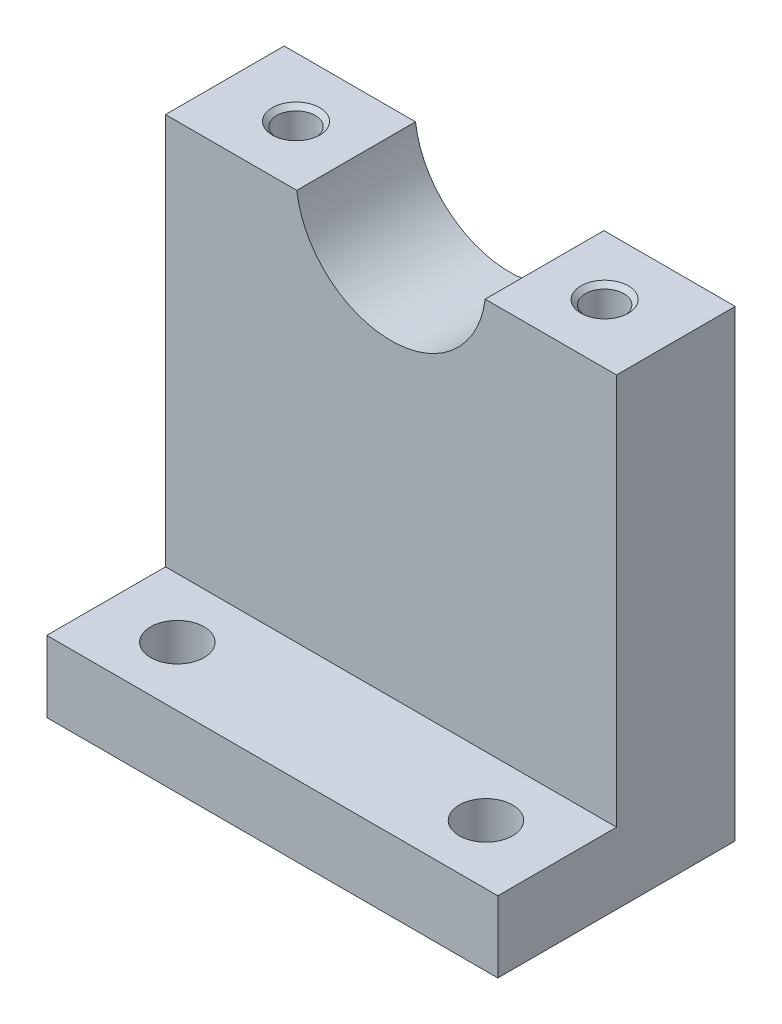
ISO-10303-21;
HEADER;
FILE_DESCRIPTION(('STEP AP214'),'2;1');
FILE_NAME('part.step','',(''),(''),'','','');
FILE_SCHEMA(('AUTOMOTIVE_DESIGN { 1 0 10303 214 1 1 1 1 }'));
ENDSEC;
DATA;
#1=APPLICATION_CONTEXT('core data for automotive mechanical design processes');
#2=APPLICATION_PROTOCOL_DEFINITION('international standard','automotive_design',2000,#1);
#3=PRODUCT_CONTEXT('',#1,'mechanical');
#4=PRODUCT('Part','Part','',(#3));
#5=PRODUCT_RELATED_PRODUCT_CATEGORY('part','',(#4));
#6=PRODUCT_DEFINITION_FORMATION('','',#4);
#7=PRODUCT_DEFINITION_CONTEXT('part definition',#1,'design');
#8=PRODUCT_DEFINITION('design','',#6,#7);
#9=PRODUCT_DEFINITION_SHAPE('','',#8);
#10=(LENGTH_UNIT() NAMED_UNIT(*) SI_UNIT(.MILLI.,.METRE.));
#11=(NAMED_UNIT(*) PLANE_ANGLE_UNIT() SI_UNIT($,.RADIAN.));
#12=(NAMED_UNIT(*) SI_UNIT($,.STERADIAN.) SOLID_ANGLE_UNIT());
#13=UNCERTAINTY_MEASURE_WITH_UNIT(LENGTH_MEASURE(1.E-05),#10,'distance_accuracy_value','');
#14=(GEOMETRIC_REPRESENTATION_CONTEXT(3) GLOBAL_UNCERTAINTY_ASSIGNED_CONTEXT((#13)) GLOBAL_UNIT_ASSIGNED_CONTEXT((#10,
#11,#12)) REPRESENTATION_CONTEXT('',''));
#15=CARTESIAN_POINT('',(0.,0.,0.));
#16=DIRECTION('',(0.,0.,1.));
#17=DIRECTION('',(1.,0.,0.));
#18=AXIS2_PLACEMENT_3D('',#15,#16,#17);
#19=CARTESIAN_POINT('',(13.,23.93588478634,5.));
#20=DIRECTION('',(0.,1.,0.));
#21=DIRECTION('',(-1.,0.,0.));
#22=AXIS2_PLACEMENT_3D('',#19,#20,#21);
#23=CONICAL_SURFACE('',#22,1.62100000005239,1.04719755120201);
#24=CARTESIAN_POINT('',(13.,22.9999999999393,5.0000000000523));
#25=VERTEX_POINT('',#24);
#26=VERTEX_LOOP('',#25);
#27=FACE_BOUND('',#26,.T.);
#28=CARTESIAN_POINT('',(13.,23.9358847863564,5.));
#29=DIRECTION('',(0.,1.,0.));
#30=DIRECTION('',(0.,0.,1.));
#31=AXIS2_PLACEMENT_3D('',#28,#29,#30);
#32=CIRCLE('',#31,1.621);
#33=CARTESIAN_POINT('',(13.,23.9358847863564,6.621));
#34=VERTEX_POINT('',#33);
#35=EDGE_CURVE('E230',#34,#34,#32,.T.);
#36=ORIENTED_EDGE('',*,*,#35,.T.);
#37=EDGE_LOOP('',(#36));
#38=FACE_BOUND('',#37,.T.);
#39=ADVANCED_FACE('F17',(#27,#38),#23,.F.);
#40=CARTESIAN_POINT('',(-13.,23.93588478634,5.));
#41=DIRECTION('',(0.,1.,0.));
#42=DIRECTION('',(-1.,0.,0.));
#43=AXIS2_PLACEMENT_3D('',#40,#41,#42);
#44=CONICAL_SURFACE('',#43,1.62100000005239,1.04719755120201);
#45=CARTESIAN_POINT('',(-13.,22.9999999999393,5.0000000000523));
#46=VERTEX_POINT('',#45);
#47=VERTEX_LOOP('',#46);
#48=FACE_BOUND('',#47,.T.);
#49=CARTESIAN_POINT('',(-13.,23.9358847863564,5.));
#50=DIRECTION('',(0.,1.,0.));
#51=DIRECTION('',(0.,0.,1.));
#52=AXIS2_PLACEMENT_3D('',#49,#50,#51);
#53=CIRCLE('',#52,1.621);
#54=CARTESIAN_POINT('',(-13.,23.9358847863564,6.621));
#55=VERTEX_POINT('',#54);
#56=EDGE_CURVE('E226',#55,#55,#53,.T.);
#57=ORIENTED_EDGE('',*,*,#56,.T.);
#58=EDGE_LOOP('',(#57));
#59=FACE_BOUND('',#58,.T.);
#60=ADVANCED_FACE('F335',(#48,#59),#44,.F.);
#61=CARTESIAN_POINT('',(13.,23.,5.));
#62=DIRECTION('',(0.,1.,0.));
#63=DIRECTION('',(0.,0.,1.));
#64=AXIS2_PLACEMENT_3D('',#61,#62,#63);
#65=CYLINDRICAL_SURFACE('',#64,1.621);
#66=ORIENTED_EDGE('',*,*,#35,.F.);
#67=EDGE_LOOP('',(#66));
#68=FACE_BOUND('',#67,.T.);
#69=CARTESIAN_POINT('',(13.,38.6210000000347,5.));
#70=DIRECTION('',(0.,1.,0.));
#71=DIRECTION('',(0.,0.,1.));
#72=AXIS2_PLACEMENT_3D('',#69,#70,#71);
#73=CIRCLE('',#72,1.62099999999555);
#74=CARTESIAN_POINT('',(13.,38.6210000000347,6.62099999999555));
#75=VERTEX_POINT('',#74);
#76=EDGE_CURVE('E222',#75,#75,#73,.T.);
#77=ORIENTED_EDGE('',*,*,#76,.T.);
#78=EDGE_LOOP('',(#77));
#79=FACE_BOUND('',#78,.T.);
#80=ADVANCED_FACE('F332',(#68,#79),#65,.F.);
#81=CARTESIAN_POINT('',(-13.,23.,5.));
#82=DIRECTION('',(0.,1.,0.));
#83=DIRECTION('',(0.,0.,1.));
#84=AXIS2_PLACEMENT_3D('',#81,#82,#83);
#85=CYLINDRICAL_SURFACE('',#84,1.621);
#86=ORIENTED_EDGE('',*,*,#56,.F.);
#87=EDGE_LOOP('',(#86));
#88=FACE_BOUND('',#87,.T.);
#89=CARTESIAN_POINT('',(-13.,38.6210000000347,5.));
#90=DIRECTION('',(0.,1.,0.));
#91=DIRECTION('',(0.,0.,1.));
#92=AXIS2_PLACEMENT_3D('',#89,#90,#91);
#93=CIRCLE('',#92,1.62099999999555);
#94=CARTESIAN_POINT('',(-13.,38.6210000000347,6.62099999999555));
#95=VERTEX_POINT('',#94);
#96=EDGE_CURVE('E211',#95,#95,#93,.T.);
#97=ORIENTED_EDGE('',*,*,#96,.T.);
#98=EDGE_LOOP('',(#97));
#99=FACE_BOUND('',#98,.T.);
#100=ADVANCED_FACE('F261',(#88,#99),#85,.F.);
#101=CARTESIAN_POINT('',(13.,6.,15.));
#102=DIRECTION('',(0.,1.,0.));
#103=DIRECTION('',(0.,0.,1.));
#104=AXIS2_PLACEMENT_3D('',#101,#102,#103);
#105=CYLINDRICAL_SURFACE('',#104,2.25);
#106=CARTESIAN_POINT('',(13.,6.,15.));
#107=DIRECTION('',(0.,1.,0.));
#108=DIRECTION('',(0.,0.,1.));
#109=AXIS2_PLACEMENT_3D('',#106,#107,#108);
#110=CIRCLE('',#109,2.25);
#111=CARTESIAN_POINT('',(13.,6.,17.25));
#112=VERTEX_POINT('',#111);
#113=EDGE_CURVE('E20',#112,#112,#110,.F.);
#114=ORIENTED_EDGE('',*,*,#113,.F.);
#115=EDGE_LOOP('',(#114));
#116=FACE_BOUND('',#115,.T.);
#117=CARTESIAN_POINT('',(13.,0.,15.));
#118=DIRECTION('',(0.,1.,0.));
#119=DIRECTION('',(0.,0.,1.));
#120=AXIS2_PLACEMENT_3D('',#117,#118,#119);
#121=CIRCLE('',#120,2.25);
#122=CARTESIAN_POINT('',(13.,0.,17.25));
#123=VERTEX_POINT('',#122);
#124=EDGE_CURVE('E176',#123,#123,#121,.F.);
#125=ORIENTED_EDGE('',*,*,#124,.T.);
#126=EDGE_LOOP('',(#125));
#127=FACE_BOUND('',#126,.T.);
#128=ADVANCED_FACE('F257',(#116,#127),#105,.F.);
#129=CARTESIAN_POINT('',(-13.,6.,15.));
#130=DIRECTION('',(0.,1.,0.));
#131=DIRECTION('',(0.,0.,1.));
#132=AXIS2_PLACEMENT_3D('',#129,#130,#131);
#133=CYLINDRICAL_SURFACE('',#132,2.25);
#134=CARTESIAN_POINT('',(-13.,6.,15.));
#135=DIRECTION('',(0.,1.,0.));
#136=DIRECTION('',(0.,0.,1.));
#137=AXIS2_PLACEMENT_3D('',#134,#135,#136);
#138=CIRCLE('',#137,2.25);
#139=CARTESIAN_POINT('',(-13.,6.,17.25));
#140=VERTEX_POINT('',#139);
#141=EDGE_CURVE('E177',#140,#140,#138,.F.);
#142=ORIENTED_EDGE('',*,*,#141,.F.);
#143=EDGE_LOOP('',(#142));
#144=FACE_BOUND('',#143,.T.);
#145=CARTESIAN_POINT('',(-13.,0.,15.));
#146=DIRECTION('',(0.,1.,0.));
#147=DIRECTION('',(0.,0.,1.));
#148=AXIS2_PLACEMENT_3D('',#145,#146,#147);
#149=CIRCLE('',#148,2.25);
#150=CARTESIAN_POINT('',(-13.,0.,17.25));
#151=VERTEX_POINT('',#150);
#152=EDGE_CURVE('E202',#151,#151,#149,.F.);
#153=ORIENTED_EDGE('',*,*,#152,.T.);
#154=EDGE_LOOP('',(#153));
#155=FACE_BOUND('',#154,.T.);
#156=ADVANCED_FACE('F260',(#144,#155),#133,.F.);
#157=CARTESIAN_POINT('',(13.,39.000000000101,5.));
#158=DIRECTION('',(0.,1.,0.));
#159=DIRECTION('',(0.,0.,1.));
#160=AXIS2_PLACEMENT_3D('',#157,#158,#159);
#161=CONICAL_SURFACE('',#160,2.00000000006185,0.785398163397448);
#162=ORIENTED_EDGE('',*,*,#76,.F.);
#163=EDGE_LOOP('',(#162));
#164=FACE_BOUND('',#163,.T.);
#165=CARTESIAN_POINT('',(13.,39.0000000000441,5.));
#166=DIRECTION('',(0.,1.,0.));
#167=DIRECTION('',(0.,0.,1.));
#168=AXIS2_PLACEMENT_3D('',#165,#166,#167);
#169=CIRCLE('',#168,2.000000000005);
#170=CARTESIAN_POINT('',(13.,39.0000000000441,7.000000000005));
#171=VERTEX_POINT('',#170);
#172=EDGE_CURVE('E131',#171,#171,#169,.T.);
#173=ORIENTED_EDGE('',*,*,#172,.T.);
#174=EDGE_LOOP('',(#173));
#175=FACE_BOUND('',#174,.T.);
#176=ADVANCED_FACE('F315',(#164,#175),#161,.F.);
#177=CARTESIAN_POINT('',(-13.,39.000000000101,5.));
#178=DIRECTION('',(0.,1.,0.));
#179=DIRECTION('',(0.,0.,1.));
#180=AXIS2_PLACEMENT_3D('',#177,#178,#179);
#181=CONICAL_SURFACE('',#180,2.00000000006185,0.785398163397448);
#182=ORIENTED_EDGE('',*,*,#96,.F.);
#183=EDGE_LOOP('',(#182));
#184=FACE_BOUND('',#183,.T.);
#185=CARTESIAN_POINT('',(-13.,39.0000000000441,5.));
#186=DIRECTION('',(0.,1.,0.));
#187=DIRECTION('',(0.,0.,1.));
#188=AXIS2_PLACEMENT_3D('',#185,#186,#187);
#189=CIRCLE('',#188,2.000000000005);
#190=CARTESIAN_POINT('',(-13.,39.0000000000441,7.000000000005));
#191=VERTEX_POINT('',#190);
#192=EDGE_CURVE('E106',#191,#191,#189,.T.);
#193=ORIENTED_EDGE('',*,*,#192,.T.);
#194=EDGE_LOOP('',(#193));
#195=FACE_BOUND('',#194,.T.);
#196=ADVANCED_FACE('F313',(#184,#195),#181,.F.);
#197=CARTESIAN_POINT('',(0.,40.,20.));
#198=DIRECTION('',(0.,0.,1.));
#199=DIRECTION('',(1.,0.,0.));
#200=AXIS2_PLACEMENT_3D('',#197,#198,#199);
#201=PLANE('',#200);
#202=DIRECTION('',(0.,1.,0.));
#203=VECTOR('',#202,1.);
#204=CARTESIAN_POINT('',(-19.,39.,20.));
#205=LINE('',#204,#203);
#206=CARTESIAN_POINT('',(-19.,6.,20.));
#207=VERTEX_POINT('',#206);
#208=CARTESIAN_POINT('',(-19.,0.,20.));
#209=VERTEX_POINT('',#208);
#210=EDGE_CURVE('E164',#207,#209,#205,.F.);
#211=ORIENTED_EDGE('',*,*,#210,.T.);
#212=DIRECTION('',(1.,0.,0.));
#213=VECTOR('',#212,1.);
#214=CARTESIAN_POINT('',(-19.,0.,20.));
#215=LINE('',#214,#213);
#216=CARTESIAN_POINT('',(19.,0.,20.));
#217=VERTEX_POINT('',#216);
#218=EDGE_CURVE('E173',#209,#217,#215,.T.);
#219=ORIENTED_EDGE('',*,*,#218,.T.);
#220=DIRECTION('',(0.,1.,0.));
#221=VECTOR('',#220,1.);
#222=CARTESIAN_POINT('',(19.,0.,20.));
#223=LINE('',#222,#221);
#224=CARTESIAN_POINT('',(19.,6.,20.));
#225=VERTEX_POINT('',#224);
#226=EDGE_CURVE('E151',#217,#225,#223,.T.);
#227=ORIENTED_EDGE('',*,*,#226,.T.);
#228=DIRECTION('',(1.,0.,0.));
#229=VECTOR('',#228,1.);
#230=CARTESIAN_POINT('',(19.,6.,20.));
#231=LINE('',#230,#229);
#232=EDGE_CURVE('E185',#207,#225,#231,.T.);
#233=ORIENTED_EDGE('',*,*,#232,.F.);
#234=EDGE_LOOP('',(#211,#219,#227,#233));
#235=FACE_BOUND('',#234,.T.);
#236=ADVANCED_FACE('F290',(#235),#201,.T.);
#237=CARTESIAN_POINT('',(19.,6.,10.));
#238=DIRECTION('',(0.,0.,1.));
#239=DIRECTION('',(1.,0.,0.));
#240=AXIS2_PLACEMENT_3D('',#237,#238,#239);
#241=PLANE('',#240);
#242=DIRECTION('',(1.,0.,0.));
#243=VECTOR('',#242,1.);
#244=CARTESIAN_POINT('',(19.,6.,10.));
#245=LINE('',#244,#243);
#246=CARTESIAN_POINT('',(19.,6.,10.));
#247=VERTEX_POINT('',#246);
#248=CARTESIAN_POINT('',(-19.,6.,10.));
#249=VERTEX_POINT('',#248);
#250=EDGE_CURVE('E188',#247,#249,#245,.F.);
#251=ORIENTED_EDGE('',*,*,#250,.F.);
#252=DIRECTION('',(0.,1.,0.));
#253=VECTOR('',#252,1.);
#254=CARTESIAN_POINT('',(19.,0.,10.));
#255=LINE('',#254,#253);
#256=CARTESIAN_POINT('',(19.,39.,10.));
#257=VERTEX_POINT('',#256);
#258=EDGE_CURVE('E152',#247,#257,#255,.T.);
#259=ORIENTED_EDGE('',*,*,#258,.T.);
#260=DIRECTION('',(1.,0.,0.));
#261=VECTOR('',#260,1.);
#262=CARTESIAN_POINT('',(19.,39.,10.));
#263=LINE('',#262,#261);
#264=CARTESIAN_POINT('',(7.93725393319377,39.,10.));
#265=VERTEX_POINT('',#264);
#266=EDGE_CURVE('E86',#257,#265,#263,.F.);
#267=ORIENTED_EDGE('',*,*,#266,.T.);
#268=CARTESIAN_POINT('',(0.,40.,10.));
#269=DIRECTION('',(0.,0.,1.));
#270=DIRECTION('',(1.,0.,0.));
#271=AXIS2_PLACEMENT_3D('',#268,#269,#270);
#272=CIRCLE('',#271,8.);
#273=CARTESIAN_POINT('',(-7.93725393319377,39.,10.));
#274=VERTEX_POINT('',#273);
#275=EDGE_CURVE('E88',#265,#274,#272,.F.);
#276=ORIENTED_EDGE('',*,*,#275,.T.);
#277=DIRECTION('',(1.,0.,0.));
#278=VECTOR('',#277,1.);
#279=CARTESIAN_POINT('',(-7.93725393319377,39.,10.));
#280=LINE('',#279,#278);
#281=CARTESIAN_POINT('',(-19.,39.,10.));
#282=VERTEX_POINT('',#281);
#283=EDGE_CURVE('E93',#274,#282,#280,.F.);
#284=ORIENTED_EDGE('',*,*,#283,.T.);
#285=DIRECTION('',(0.,1.,0.));
#286=VECTOR('',#285,1.);
#287=CARTESIAN_POINT('',(-19.,39.,10.));
#288=LINE('',#287,#286);
#289=EDGE_CURVE('E125',#282,#249,#288,.F.);
#290=ORIENTED_EDGE('',*,*,#289,.T.);
#291=EDGE_LOOP('',(#251,#259,#267,#276,#284,#290));
#292=FACE_BOUND('',#291,.T.);
#293=ADVANCED_FACE('F91',(#292),#241,.T.);
#294=CARTESIAN_POINT('',(19.,6.,30.));
#295=DIRECTION('',(0.,1.,0.));
#296=DIRECTION('',(0.,0.,1.));
#297=AXIS2_PLACEMENT_3D('',#294,#295,#296);
#298=PLANE('',#297);
#299=ORIENTED_EDGE('',*,*,#141,.T.);
#300=EDGE_LOOP('',(#299));
#301=FACE_BOUND('',#300,.T.);
#302=ORIENTED_EDGE('',*,*,#113,.T.);
#303=EDGE_LOOP('',(#302));
#304=FACE_BOUND('',#303,.T.);
#305=DIRECTION('',(0.,0.,-1.));
#306=VECTOR('',#305,1.);
#307=CARTESIAN_POINT('',(-19.,6.,20.));
#308=LINE('',#307,#306);
#309=EDGE_CURVE('E158',#249,#207,#308,.F.);
#310=ORIENTED_EDGE('',*,*,#309,.T.);
#311=ORIENTED_EDGE('',*,*,#232,.T.);
#312=DIRECTION('',(0.,0.,1.));
#313=VECTOR('',#312,1.);
#314=CARTESIAN_POINT('',(19.,6.,20.));
#315=LINE('',#314,#313);
#316=EDGE_CURVE('E136',#225,#247,#315,.F.);
#317=ORIENTED_EDGE('',*,*,#316,.T.);
#318=ORIENTED_EDGE('',*,*,#250,.T.);
#319=EDGE_LOOP('',(#310,#311,#317,#318));
#320=FACE_BOUND('',#319,.T.);
#321=ADVANCED_FACE('F254',(#301,#304,#320),#298,.T.);
#322=CARTESIAN_POINT('',(-19.,0.,20.));
#323=DIRECTION('',(0.,1.,0.));
#324=DIRECTION('',(0.,0.,1.));
#325=AXIS2_PLACEMENT_3D('',#322,#323,#324);
#326=PLANE('',#325);
#327=ORIENTED_EDGE('',*,*,#152,.F.);
#328=EDGE_LOOP('',(#327));
#329=FACE_BOUND('',#328,.T.);
#330=ORIENTED_EDGE('',*,*,#124,.F.);
#331=EDGE_LOOP('',(#330));
#332=FACE_BOUND('',#331,.T.);
#333=DIRECTION('',(0.,0.,1.));
#334=VECTOR('',#333,1.);
#335=CARTESIAN_POINT('',(19.,0.,20.));
#336=LINE('',#335,#334);
#337=CARTESIAN_POINT('',(19.,0.,0.));
#338=VERTEX_POINT('',#337);
#339=EDGE_CURVE('E147',#338,#217,#336,.T.);
#340=ORIENTED_EDGE('',*,*,#339,.T.);
#341=ORIENTED_EDGE('',*,*,#218,.F.);
#342=DIRECTION('',(0.,0.,-1.));
#343=VECTOR('',#342,1.);
#344=CARTESIAN_POINT('',(-19.,0.,20.));
#345=LINE('',#344,#343);
#346=CARTESIAN_POINT('',(-19.,0.,0.));
#347=VERTEX_POINT('',#346);
#348=EDGE_CURVE('E126',#209,#347,#345,.T.);
#349=ORIENTED_EDGE('',*,*,#348,.T.);
#350=DIRECTION('',(1.,0.,0.));
#351=VECTOR('',#350,1.);
#352=CARTESIAN_POINT('',(0.,0.,0.));
#353=LINE('',#352,#351);
#354=EDGE_CURVE('E144',#347,#338,#353,.T.);
#355=ORIENTED_EDGE('',*,*,#354,.T.);
#356=EDGE_LOOP('',(#340,#341,#349,#355));
#357=FACE_BOUND('',#356,.T.);
#358=ADVANCED_FACE('F265',(#329,#332,#357),#326,.F.);
#359=CARTESIAN_POINT('',(19.,0.,20.));
#360=DIRECTION('',(-1.,0.,0.));
#361=DIRECTION('',(0.,0.,1.));
#362=AXIS2_PLACEMENT_3D('',#359,#360,#361);
#363=PLANE('',#362);
#364=ORIENTED_EDGE('',*,*,#226,.F.);
#365=ORIENTED_EDGE('',*,*,#339,.F.);
#366=DIRECTION('',(0.,1.,0.));
#367=VECTOR('',#366,1.);
#368=CARTESIAN_POINT('',(19.,40.,0.));
#369=LINE('',#368,#367);
#370=CARTESIAN_POINT('',(19.,39.,0.));
#371=VERTEX_POINT('',#370);
#372=EDGE_CURVE('E139',#338,#371,#369,.T.);
#373=ORIENTED_EDGE('',*,*,#372,.T.);
#374=DIRECTION('',(0.,0.,-1.));
#375=VECTOR('',#374,1.);
#376=CARTESIAN_POINT('',(19.,39.,20.));
#377=LINE('',#376,#375);
#378=EDGE_CURVE('E132',#371,#257,#377,.F.);
#379=ORIENTED_EDGE('',*,*,#378,.T.);
#380=ORIENTED_EDGE('',*,*,#258,.F.);
#381=ORIENTED_EDGE('',*,*,#316,.F.);
#382=EDGE_LOOP('',(#364,#365,#373,#379,#380,#381));
#383=FACE_BOUND('',#382,.T.);
#384=ADVANCED_FACE('F268',(#383),#363,.F.);
#385=CARTESIAN_POINT('',(19.,39.,20.));
#386=DIRECTION('',(0.,-1.,0.));
#387=DIRECTION('',(0.,0.,-1.));
#388=AXIS2_PLACEMENT_3D('',#385,#386,#387);
#389=PLANE('',#388);
#390=ORIENTED_EDGE('',*,*,#172,.F.);
#391=EDGE_LOOP('',(#390));
#392=FACE_BOUND('',#391,.T.);
#393=ORIENTED_EDGE('',*,*,#378,.F.);
#394=DIRECTION('',(1.,0.,0.));
#395=VECTOR('',#394,1.);
#396=CARTESIAN_POINT('',(0.,39.,0.));
#397=LINE('',#396,#395);
#398=CARTESIAN_POINT('',(7.93725393319377,39.,0.));
#399=VERTEX_POINT('',#398);
#400=EDGE_CURVE('E143',#371,#399,#397,.F.);
#401=ORIENTED_EDGE('',*,*,#400,.T.);
#402=DIRECTION('',(0.,0.,1.));
#403=VECTOR('',#402,1.);
#404=CARTESIAN_POINT('',(7.93725393319377,39.,20.));
#405=LINE('',#404,#403);
#406=EDGE_CURVE('E99',#399,#265,#405,.T.);
#407=ORIENTED_EDGE('',*,*,#406,.T.);
#408=ORIENTED_EDGE('',*,*,#266,.F.);
#409=EDGE_LOOP('',(#393,#401,#407,#408));
#410=FACE_BOUND('',#409,.T.);
#411=ADVANCED_FACE('F291',(#392,#410),#389,.F.);
#412=CARTESIAN_POINT('',(0.,40.,20.));
#413=DIRECTION('',(0.,0.,1.));
#414=DIRECTION('',(1.,0.,0.));
#415=AXIS2_PLACEMENT_3D('',#412,#413,#414);
#416=CYLINDRICAL_SURFACE('',#415,8.);
#417=ORIENTED_EDGE('',*,*,#275,.F.);
#418=ORIENTED_EDGE('',*,*,#406,.F.);
#419=CARTESIAN_POINT('',(0.,40.,0.));
#420=DIRECTION('',(0.,0.,1.));
#421=DIRECTION('',(1.,0.,0.));
#422=AXIS2_PLACEMENT_3D('',#419,#420,#421);
#423=CIRCLE('',#422,8.);
#424=CARTESIAN_POINT('',(-7.93725393319377,39.,0.));
#425=VERTEX_POINT('',#424);
#426=EDGE_CURVE('E111',#399,#425,#423,.F.);
#427=ORIENTED_EDGE('',*,*,#426,.T.);
#428=DIRECTION('',(0.,0.,-1.));
#429=VECTOR('',#428,1.);
#430=CARTESIAN_POINT('',(-7.93725393319377,39.,20.));
#431=LINE('',#430,#429);
#432=EDGE_CURVE('E98',#425,#274,#431,.F.);
#433=ORIENTED_EDGE('',*,*,#432,.T.);
#434=EDGE_LOOP('',(#417,#418,#427,#433));
#435=FACE_BOUND('',#434,.T.);
#436=ADVANCED_FACE('F109',(#435),#416,.F.);
#437=CARTESIAN_POINT('',(-7.93725393319377,39.,20.));
#438=DIRECTION('',(0.,-1.,0.));
#439=DIRECTION('',(0.,0.,-1.));
#440=AXIS2_PLACEMENT_3D('',#437,#438,#439);
#441=PLANE('',#440);
#442=ORIENTED_EDGE('',*,*,#192,.F.);
#443=EDGE_LOOP('',(#442));
#444=FACE_BOUND('',#443,.T.);
#445=ORIENTED_EDGE('',*,*,#432,.F.);
#446=DIRECTION('',(1.,0.,0.));
#447=VECTOR('',#446,1.);
#448=CARTESIAN_POINT('',(0.,39.,0.));
#449=LINE('',#448,#447);
#450=CARTESIAN_POINT('',(-19.,39.,0.));
#451=VERTEX_POINT('',#450);
#452=EDGE_CURVE('E27',#425,#451,#449,.F.);
#453=ORIENTED_EDGE('',*,*,#452,.T.);
#454=DIRECTION('',(0.,0.,-1.));
#455=VECTOR('',#454,1.);
#456=CARTESIAN_POINT('',(-19.,39.,20.));
#457=LINE('',#456,#455);
#458=EDGE_CURVE('E35',#451,#282,#457,.F.);
#459=ORIENTED_EDGE('',*,*,#458,.T.);
#460=ORIENTED_EDGE('',*,*,#283,.F.);
#461=EDGE_LOOP('',(#445,#453,#459,#460));
#462=FACE_BOUND('',#461,.T.);
#463=ADVANCED_FACE('F102',(#444,#462),#441,.F.);
#464=CARTESIAN_POINT('',(-19.,39.,20.));
#465=DIRECTION('',(1.,0.,0.));
#466=DIRECTION('',(0.,0.,-1.));
#467=AXIS2_PLACEMENT_3D('',#464,#465,#466);
#468=PLANE('',#467);
#469=ORIENTED_EDGE('',*,*,#289,.F.);
#470=ORIENTED_EDGE('',*,*,#458,.F.);
#471=DIRECTION('',(0.,1.,0.));
#472=VECTOR('',#471,1.);
#473=CARTESIAN_POINT('',(-19.,40.,0.));
#474=LINE('',#473,#472);
#475=EDGE_CURVE('E11',#451,#347,#474,.F.);
#476=ORIENTED_EDGE('',*,*,#475,.T.);
#477=ORIENTED_EDGE('',*,*,#348,.F.);
#478=ORIENTED_EDGE('',*,*,#210,.F.);
#479=ORIENTED_EDGE('',*,*,#309,.F.);
#480=EDGE_LOOP('',(#469,#470,#476,#477,#478,#479));
#481=FACE_BOUND('',#480,.T.);
#482=ADVANCED_FACE('F286',(#481),#468,.F.);
#483=CARTESIAN_POINT('',(0.,40.,0.));
#484=DIRECTION('',(0.,0.,1.));
#485=DIRECTION('',(1.,0.,0.));
#486=AXIS2_PLACEMENT_3D('',#483,#484,#485);
#487=PLANE('',#486);
#488=ORIENTED_EDGE('',*,*,#452,.F.);
#489=ORIENTED_EDGE('',*,*,#426,.F.);
#490=ORIENTED_EDGE('',*,*,#400,.F.);
#491=ORIENTED_EDGE('',*,*,#372,.F.);
#492=ORIENTED_EDGE('',*,*,#354,.F.);
#493=ORIENTED_EDGE('',*,*,#475,.F.);
#494=EDGE_LOOP('',(#488,#489,#490,#491,#492,#493));
#495=FACE_BOUND('',#494,.T.);
#496=ADVANCED_FACE('F278',(#495),#487,.F.);
#497=CLOSED_SHELL('',(#39,#60,#80,#100,#128,#156,#176,#196,#236,#293,#321,#358,#384,#411,#436,
#463,#482,#496));
#498=MANIFOLD_SOLID_BREP('B1',#497);
#499=ADVANCED_BREP_SHAPE_REPRESENTATION('',(#18,#498),#14);
#500=SHAPE_DEFINITION_REPRESENTATION(#9,#499);
ENDSEC;
END-ISO-10303-21;
